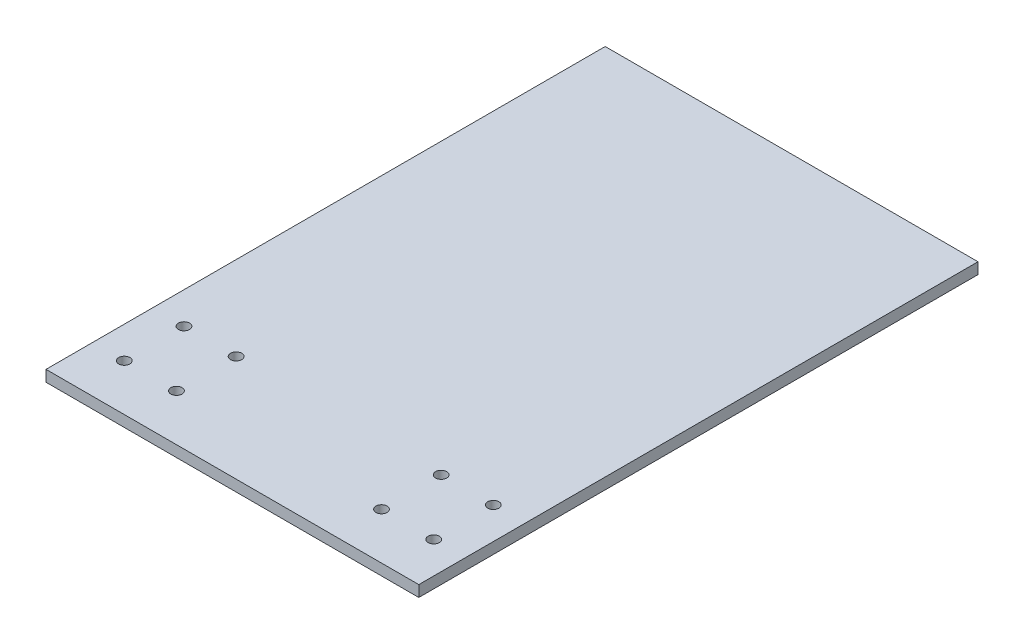
ISO-10303-21;
HEADER;
FILE_DESCRIPTION(('STEP AP214'),'2;1');
FILE_NAME('part.step','',(''),(''),'','','');
FILE_SCHEMA(('AUTOMOTIVE_DESIGN { 1 0 10303 214 1 1 1 1 }'));
ENDSEC;
DATA;
#1=APPLICATION_CONTEXT('core data for automotive mechanical design processes');
#2=APPLICATION_PROTOCOL_DEFINITION('international standard','automotive_design',2000,#1);
#3=PRODUCT_CONTEXT('',#1,'mechanical');
#4=PRODUCT('Part','Part','',(#3));
#5=PRODUCT_RELATED_PRODUCT_CATEGORY('part','',(#4));
#6=PRODUCT_DEFINITION_FORMATION('','',#4);
#7=PRODUCT_DEFINITION_CONTEXT('part definition',#1,'design');
#8=PRODUCT_DEFINITION('design','',#6,#7);
#9=PRODUCT_DEFINITION_SHAPE('','',#8);
#10=(LENGTH_UNIT() NAMED_UNIT(*) SI_UNIT(.MILLI.,.METRE.));
#11=(NAMED_UNIT(*) PLANE_ANGLE_UNIT() SI_UNIT($,.RADIAN.));
#12=(NAMED_UNIT(*) SI_UNIT($,.STERADIAN.) SOLID_ANGLE_UNIT());
#13=UNCERTAINTY_MEASURE_WITH_UNIT(LENGTH_MEASURE(1.E-05),#10,'distance_accuracy_value','');
#14=(GEOMETRIC_REPRESENTATION_CONTEXT(3) GLOBAL_UNCERTAINTY_ASSIGNED_CONTEXT((#13)) GLOBAL_UNIT_ASSIGNED_CONTEXT((#10,
#11,#12)) REPRESENTATION_CONTEXT('',''));
#15=CARTESIAN_POINT('',(0.,0.,0.));
#16=DIRECTION('',(0.,0.,1.));
#17=DIRECTION('',(1.,0.,0.));
#18=AXIS2_PLACEMENT_3D('',#15,#16,#17);
#19=CARTESIAN_POINT('',(0.,3.,0.));
#20=DIRECTION('',(0.,1.,0.));
#21=DIRECTION('',(0.,0.,1.));
#22=AXIS2_PLACEMENT_3D('',#19,#20,#21);
#23=PLANE('',#22);
#24=CARTESIAN_POINT('',(27.5,3.,46.4999999999999));
#25=DIRECTION('',(0.,1.,0.));
#26=DIRECTION('',(0.,0.,-1.));
#27=AXIS2_PLACEMENT_3D('',#24,#25,#26);
#28=CIRCLE('',#27,1.5);
#29=CARTESIAN_POINT('',(27.5,3.,44.9999999999999));
#30=VERTEX_POINT('',#29);
#31=EDGE_CURVE('E174',#30,#30,#28,.T.);
#32=ORIENTED_EDGE('',*,*,#31,.F.);
#33=EDGE_LOOP('',(#32));
#34=FACE_BOUND('',#33,.T.);
#35=CARTESIAN_POINT('',(41.5,3.,62.4999999999999));
#36=DIRECTION('',(0.,1.,0.));
#37=DIRECTION('',(0.,0.,-1.));
#38=AXIS2_PLACEMENT_3D('',#35,#36,#37);
#39=CIRCLE('',#38,1.5);
#40=CARTESIAN_POINT('',(41.5,3.,60.9999999999999));
#41=VERTEX_POINT('',#40);
#42=EDGE_CURVE('E158',#41,#41,#39,.T.);
#43=ORIENTED_EDGE('',*,*,#42,.F.);
#44=EDGE_LOOP('',(#43));
#45=FACE_BOUND('',#44,.T.);
#46=CARTESIAN_POINT('',(-27.5,3.,62.5));
#47=DIRECTION('',(0.,1.,0.));
#48=DIRECTION('',(0.,0.,-1.));
#49=AXIS2_PLACEMENT_3D('',#46,#47,#48);
#50=CIRCLE('',#49,1.5);
#51=CARTESIAN_POINT('',(-27.5,3.,61.));
#52=VERTEX_POINT('',#51);
#53=EDGE_CURVE('E142',#52,#52,#50,.T.);
#54=ORIENTED_EDGE('',*,*,#53,.F.);
#55=EDGE_LOOP('',(#54));
#56=FACE_BOUND('',#55,.T.);
#57=CARTESIAN_POINT('',(-41.5,3.,62.5));
#58=DIRECTION('',(0.,1.,0.));
#59=DIRECTION('',(0.,0.,1.));
#60=AXIS2_PLACEMENT_3D('',#57,#58,#59);
#61=CIRCLE('',#60,1.5);
#62=CARTESIAN_POINT('',(-41.5,3.,64.));
#63=VERTEX_POINT('',#62);
#64=EDGE_CURVE('E112',#63,#63,#61,.T.);
#65=ORIENTED_EDGE('',*,*,#64,.F.);
#66=EDGE_LOOP('',(#65));
#67=FACE_BOUND('',#66,.T.);
#68=DIRECTION('',(0.,0.,-1.));
#69=VECTOR('',#68,1.);
#70=CARTESIAN_POINT('',(50.,3.,-75.));
#71=LINE('',#70,#69);
#72=CARTESIAN_POINT('',(50.,3.,75.));
#73=VERTEX_POINT('',#72);
#74=CARTESIAN_POINT('',(50.,3.,-75.));
#75=VERTEX_POINT('',#74);
#76=EDGE_CURVE('E92',#73,#75,#71,.T.);
#77=ORIENTED_EDGE('',*,*,#76,.T.);
#78=DIRECTION('',(-1.,0.,0.));
#79=VECTOR('',#78,1.);
#80=CARTESIAN_POINT('',(-50.,3.,-75.));
#81=LINE('',#80,#79);
#82=CARTESIAN_POINT('',(-50.,3.,-75.));
#83=VERTEX_POINT('',#82);
#84=EDGE_CURVE('E87',#75,#83,#81,.T.);
#85=ORIENTED_EDGE('',*,*,#84,.T.);
#86=DIRECTION('',(0.,0.,1.));
#87=VECTOR('',#86,1.);
#88=CARTESIAN_POINT('',(-50.,3.,-75.));
#89=LINE('',#88,#87);
#90=CARTESIAN_POINT('',(-50.,3.,75.));
#91=VERTEX_POINT('',#90);
#92=EDGE_CURVE('E90',#83,#91,#89,.T.);
#93=ORIENTED_EDGE('',*,*,#92,.T.);
#94=DIRECTION('',(1.,0.,0.));
#95=VECTOR('',#94,1.);
#96=CARTESIAN_POINT('',(-50.,3.,75.));
#97=LINE('',#96,#95);
#98=EDGE_CURVE('E57',#91,#73,#97,.T.);
#99=ORIENTED_EDGE('',*,*,#98,.T.);
#100=EDGE_LOOP('',(#77,#85,#93,#99));
#101=FACE_BOUND('',#100,.T.);
#102=CARTESIAN_POINT('',(-41.5,3.,46.5));
#103=DIRECTION('',(0.,1.,0.));
#104=DIRECTION('',(0.,0.,-1.));
#105=AXIS2_PLACEMENT_3D('',#102,#103,#104);
#106=CIRCLE('',#105,1.5);
#107=CARTESIAN_POINT('',(-41.5,3.,45.));
#108=VERTEX_POINT('',#107);
#109=EDGE_CURVE('E134',#108,#108,#106,.T.);
#110=ORIENTED_EDGE('',*,*,#109,.F.);
#111=EDGE_LOOP('',(#110));
#112=FACE_BOUND('',#111,.T.);
#113=CARTESIAN_POINT('',(-27.5,3.,46.5));
#114=DIRECTION('',(0.,1.,0.));
#115=DIRECTION('',(0.,0.,1.));
#116=AXIS2_PLACEMENT_3D('',#113,#114,#115);
#117=CIRCLE('',#116,1.5);
#118=CARTESIAN_POINT('',(-27.5,3.,48.));
#119=VERTEX_POINT('',#118);
#120=EDGE_CURVE('E150',#119,#119,#117,.T.);
#121=ORIENTED_EDGE('',*,*,#120,.F.);
#122=EDGE_LOOP('',(#121));
#123=FACE_BOUND('',#122,.T.);
#124=CARTESIAN_POINT('',(27.5,3.,62.4999999999999));
#125=DIRECTION('',(0.,1.,0.));
#126=DIRECTION('',(0.,0.,1.));
#127=AXIS2_PLACEMENT_3D('',#124,#125,#126);
#128=CIRCLE('',#127,1.5);
#129=CARTESIAN_POINT('',(27.5,3.,63.9999999999999));
#130=VERTEX_POINT('',#129);
#131=EDGE_CURVE('E166',#130,#130,#128,.T.);
#132=ORIENTED_EDGE('',*,*,#131,.F.);
#133=EDGE_LOOP('',(#132));
#134=FACE_BOUND('',#133,.T.);
#135=CARTESIAN_POINT('',(41.5,3.,46.4999999999999));
#136=DIRECTION('',(0.,1.,0.));
#137=DIRECTION('',(0.,0.,1.));
#138=AXIS2_PLACEMENT_3D('',#135,#136,#137);
#139=CIRCLE('',#138,1.5);
#140=CARTESIAN_POINT('',(41.5,3.,47.9999999999999));
#141=VERTEX_POINT('',#140);
#142=EDGE_CURVE('E182',#141,#141,#139,.T.);
#143=ORIENTED_EDGE('',*,*,#142,.F.);
#144=EDGE_LOOP('',(#143));
#145=FACE_BOUND('',#144,.T.);
#146=ADVANCED_FACE('F39',(#34,#45,#56,#67,#101,#112,#123,#134,#145),#23,.T.);
#147=CARTESIAN_POINT('',(0.,0.,0.));
#148=DIRECTION('',(0.,1.,0.));
#149=DIRECTION('',(0.,0.,1.));
#150=AXIS2_PLACEMENT_3D('',#147,#148,#149);
#151=PLANE('',#150);
#152=DIRECTION('',(0.,0.,-1.));
#153=VECTOR('',#152,1.);
#154=CARTESIAN_POINT('',(50.,0.,-75.));
#155=LINE('',#154,#153);
#156=CARTESIAN_POINT('',(50.,0.,75.));
#157=VERTEX_POINT('',#156);
#158=CARTESIAN_POINT('',(50.,0.,-75.));
#159=VERTEX_POINT('',#158);
#160=EDGE_CURVE('E108',#157,#159,#155,.T.);
#161=ORIENTED_EDGE('',*,*,#160,.F.);
#162=DIRECTION('',(1.,0.,0.));
#163=VECTOR('',#162,1.);
#164=CARTESIAN_POINT('',(-50.,0.,75.));
#165=LINE('',#164,#163);
#166=CARTESIAN_POINT('',(-50.,0.,75.));
#167=VERTEX_POINT('',#166);
#168=EDGE_CURVE('E80',#167,#157,#165,.T.);
#169=ORIENTED_EDGE('',*,*,#168,.F.);
#170=DIRECTION('',(0.,0.,1.));
#171=VECTOR('',#170,1.);
#172=CARTESIAN_POINT('',(-50.,0.,-75.));
#173=LINE('',#172,#171);
#174=CARTESIAN_POINT('',(-50.,0.,-75.));
#175=VERTEX_POINT('',#174);
#176=EDGE_CURVE('E74',#175,#167,#173,.T.);
#177=ORIENTED_EDGE('',*,*,#176,.F.);
#178=DIRECTION('',(-1.,0.,0.));
#179=VECTOR('',#178,1.);
#180=CARTESIAN_POINT('',(-50.,0.,-75.));
#181=LINE('',#180,#179);
#182=EDGE_CURVE('E97',#159,#175,#181,.T.);
#183=ORIENTED_EDGE('',*,*,#182,.F.);
#184=EDGE_LOOP('',(#161,#169,#177,#183));
#185=FACE_BOUND('',#184,.T.);
#186=CARTESIAN_POINT('',(-41.5,0.,62.5));
#187=DIRECTION('',(0.,1.,0.));
#188=DIRECTION('',(0.,0.,1.));
#189=AXIS2_PLACEMENT_3D('',#186,#187,#188);
#190=CIRCLE('',#189,1.5);
#191=CARTESIAN_POINT('',(-41.5,0.,64.));
#192=VERTEX_POINT('',#191);
#193=EDGE_CURVE('E130',#192,#192,#190,.T.);
#194=ORIENTED_EDGE('',*,*,#193,.T.);
#195=EDGE_LOOP('',(#194));
#196=FACE_BOUND('',#195,.T.);
#197=CARTESIAN_POINT('',(-41.5,0.,46.5));
#198=DIRECTION('',(0.,1.,0.));
#199=DIRECTION('',(0.,0.,-1.));
#200=AXIS2_PLACEMENT_3D('',#197,#198,#199);
#201=CIRCLE('',#200,1.5);
#202=CARTESIAN_POINT('',(-41.5,0.,45.));
#203=VERTEX_POINT('',#202);
#204=EDGE_CURVE('E138',#203,#203,#201,.T.);
#205=ORIENTED_EDGE('',*,*,#204,.T.);
#206=EDGE_LOOP('',(#205));
#207=FACE_BOUND('',#206,.T.);
#208=CARTESIAN_POINT('',(-27.5,0.,62.5));
#209=DIRECTION('',(0.,1.,0.));
#210=DIRECTION('',(0.,0.,-1.));
#211=AXIS2_PLACEMENT_3D('',#208,#209,#210);
#212=CIRCLE('',#211,1.5);
#213=CARTESIAN_POINT('',(-27.5,0.,61.));
#214=VERTEX_POINT('',#213);
#215=EDGE_CURVE('E146',#214,#214,#212,.T.);
#216=ORIENTED_EDGE('',*,*,#215,.T.);
#217=EDGE_LOOP('',(#216));
#218=FACE_BOUND('',#217,.T.);
#219=CARTESIAN_POINT('',(-27.5,0.,46.5));
#220=DIRECTION('',(0.,1.,0.));
#221=DIRECTION('',(0.,0.,1.));
#222=AXIS2_PLACEMENT_3D('',#219,#220,#221);
#223=CIRCLE('',#222,1.5);
#224=CARTESIAN_POINT('',(-27.5,0.,48.));
#225=VERTEX_POINT('',#224);
#226=EDGE_CURVE('E154',#225,#225,#223,.T.);
#227=ORIENTED_EDGE('',*,*,#226,.T.);
#228=EDGE_LOOP('',(#227));
#229=FACE_BOUND('',#228,.T.);
#230=CARTESIAN_POINT('',(41.5,0.,62.4999999999999));
#231=DIRECTION('',(0.,1.,0.));
#232=DIRECTION('',(0.,0.,-1.));
#233=AXIS2_PLACEMENT_3D('',#230,#231,#232);
#234=CIRCLE('',#233,1.5);
#235=CARTESIAN_POINT('',(41.5,0.,60.9999999999999));
#236=VERTEX_POINT('',#235);
#237=EDGE_CURVE('E162',#236,#236,#234,.T.);
#238=ORIENTED_EDGE('',*,*,#237,.T.);
#239=EDGE_LOOP('',(#238));
#240=FACE_BOUND('',#239,.T.);
#241=CARTESIAN_POINT('',(27.5,0.,62.4999999999999));
#242=DIRECTION('',(0.,1.,0.));
#243=DIRECTION('',(0.,0.,1.));
#244=AXIS2_PLACEMENT_3D('',#241,#242,#243);
#245=CIRCLE('',#244,1.5);
#246=CARTESIAN_POINT('',(27.5,0.,63.9999999999999));
#247=VERTEX_POINT('',#246);
#248=EDGE_CURVE('E170',#247,#247,#245,.T.);
#249=ORIENTED_EDGE('',*,*,#248,.T.);
#250=EDGE_LOOP('',(#249));
#251=FACE_BOUND('',#250,.T.);
#252=CARTESIAN_POINT('',(27.5,0.,46.4999999999999));
#253=DIRECTION('',(0.,1.,0.));
#254=DIRECTION('',(0.,0.,-1.));
#255=AXIS2_PLACEMENT_3D('',#252,#253,#254);
#256=CIRCLE('',#255,1.5);
#257=CARTESIAN_POINT('',(27.5,0.,44.9999999999999));
#258=VERTEX_POINT('',#257);
#259=EDGE_CURVE('E178',#258,#258,#256,.T.);
#260=ORIENTED_EDGE('',*,*,#259,.T.);
#261=EDGE_LOOP('',(#260));
#262=FACE_BOUND('',#261,.T.);
#263=CARTESIAN_POINT('',(41.5,0.,46.4999999999999));
#264=DIRECTION('',(0.,1.,0.));
#265=DIRECTION('',(0.,0.,1.));
#266=AXIS2_PLACEMENT_3D('',#263,#264,#265);
#267=CIRCLE('',#266,1.5);
#268=CARTESIAN_POINT('',(41.5,0.,47.9999999999999));
#269=VERTEX_POINT('',#268);
#270=EDGE_CURVE('E186',#269,#269,#267,.T.);
#271=ORIENTED_EDGE('',*,*,#270,.T.);
#272=EDGE_LOOP('',(#271));
#273=FACE_BOUND('',#272,.T.);
#274=ADVANCED_FACE('F125',(#185,#196,#207,#218,#229,#240,#251,#262,#273),#151,.F.);
#275=CARTESIAN_POINT('',(50.,3.,-75.));
#276=DIRECTION('',(-1.,0.,0.));
#277=DIRECTION('',(0.,0.,1.));
#278=AXIS2_PLACEMENT_3D('',#275,#276,#277);
#279=PLANE('',#278);
#280=ORIENTED_EDGE('',*,*,#160,.T.);
#281=DIRECTION('',(0.,-1.,0.));
#282=VECTOR('',#281,1.);
#283=CARTESIAN_POINT('',(50.,3.,-75.));
#284=LINE('',#283,#282);
#285=EDGE_CURVE('E11',#75,#159,#284,.T.);
#286=ORIENTED_EDGE('',*,*,#285,.F.);
#287=ORIENTED_EDGE('',*,*,#76,.F.);
#288=DIRECTION('',(0.,-1.,0.));
#289=VECTOR('',#288,1.);
#290=CARTESIAN_POINT('',(50.,3.,75.));
#291=LINE('',#290,#289);
#292=EDGE_CURVE('E104',#73,#157,#291,.T.);
#293=ORIENTED_EDGE('',*,*,#292,.T.);
#294=EDGE_LOOP('',(#280,#286,#287,#293));
#295=FACE_BOUND('',#294,.T.);
#296=ADVANCED_FACE('F41',(#295),#279,.F.);
#297=CARTESIAN_POINT('',(-50.,3.,-75.));
#298=DIRECTION('',(0.,0.,1.));
#299=DIRECTION('',(1.,0.,0.));
#300=AXIS2_PLACEMENT_3D('',#297,#298,#299);
#301=PLANE('',#300);
#302=ORIENTED_EDGE('',*,*,#182,.T.);
#303=DIRECTION('',(0.,-1.,0.));
#304=VECTOR('',#303,1.);
#305=CARTESIAN_POINT('',(-50.,3.,-75.));
#306=LINE('',#305,#304);
#307=EDGE_CURVE('E49',#83,#175,#306,.T.);
#308=ORIENTED_EDGE('',*,*,#307,.F.);
#309=ORIENTED_EDGE('',*,*,#84,.F.);
#310=ORIENTED_EDGE('',*,*,#285,.T.);
#311=EDGE_LOOP('',(#302,#308,#309,#310));
#312=FACE_BOUND('',#311,.T.);
#313=ADVANCED_FACE('F96',(#312),#301,.F.);
#314=CARTESIAN_POINT('',(-50.,3.,-75.));
#315=DIRECTION('',(1.,0.,0.));
#316=DIRECTION('',(0.,0.,-1.));
#317=AXIS2_PLACEMENT_3D('',#314,#315,#316);
#318=PLANE('',#317);
#319=ORIENTED_EDGE('',*,*,#176,.T.);
#320=DIRECTION('',(0.,-1.,0.));
#321=VECTOR('',#320,1.);
#322=CARTESIAN_POINT('',(-50.,3.,75.));
#323=LINE('',#322,#321);
#324=EDGE_CURVE('E99',#91,#167,#323,.T.);
#325=ORIENTED_EDGE('',*,*,#324,.F.);
#326=ORIENTED_EDGE('',*,*,#92,.F.);
#327=ORIENTED_EDGE('',*,*,#307,.T.);
#328=EDGE_LOOP('',(#319,#325,#326,#327));
#329=FACE_BOUND('',#328,.T.);
#330=ADVANCED_FACE('F100',(#329),#318,.F.);
#331=CARTESIAN_POINT('',(-50.,3.,75.));
#332=DIRECTION('',(0.,0.,-1.));
#333=DIRECTION('',(-1.,0.,0.));
#334=AXIS2_PLACEMENT_3D('',#331,#332,#333);
#335=PLANE('',#334);
#336=ORIENTED_EDGE('',*,*,#168,.T.);
#337=ORIENTED_EDGE('',*,*,#292,.F.);
#338=ORIENTED_EDGE('',*,*,#98,.F.);
#339=ORIENTED_EDGE('',*,*,#324,.T.);
#340=EDGE_LOOP('',(#336,#337,#338,#339));
#341=FACE_BOUND('',#340,.T.);
#342=ADVANCED_FACE('F122',(#341),#335,.F.);
#343=CARTESIAN_POINT('',(-41.5,3.,62.5));
#344=DIRECTION('',(0.,-1.,0.));
#345=DIRECTION('',(0.,0.,-1.));
#346=AXIS2_PLACEMENT_3D('',#343,#344,#345);
#347=CYLINDRICAL_SURFACE('',#346,1.5);
#348=ORIENTED_EDGE('',*,*,#64,.T.);
#349=EDGE_LOOP('',(#348));
#350=FACE_BOUND('',#349,.T.);
#351=ORIENTED_EDGE('',*,*,#193,.F.);
#352=EDGE_LOOP('',(#351));
#353=FACE_BOUND('',#352,.T.);
#354=ADVANCED_FACE('F207',(#350,#353),#347,.F.);
#355=CARTESIAN_POINT('',(-41.5,3.,46.5));
#356=DIRECTION('',(0.,-1.,0.));
#357=DIRECTION('',(0.,0.,-1.));
#358=AXIS2_PLACEMENT_3D('',#355,#356,#357);
#359=CYLINDRICAL_SURFACE('',#358,1.5);
#360=ORIENTED_EDGE('',*,*,#109,.T.);
#361=EDGE_LOOP('',(#360));
#362=FACE_BOUND('',#361,.T.);
#363=ORIENTED_EDGE('',*,*,#204,.F.);
#364=EDGE_LOOP('',(#363));
#365=FACE_BOUND('',#364,.T.);
#366=ADVANCED_FACE('F253',(#362,#365),#359,.F.);
#367=CARTESIAN_POINT('',(-27.5,3.,62.5));
#368=DIRECTION('',(0.,-1.,0.));
#369=DIRECTION('',(0.,0.,-1.));
#370=AXIS2_PLACEMENT_3D('',#367,#368,#369);
#371=CYLINDRICAL_SURFACE('',#370,1.5);
#372=ORIENTED_EDGE('',*,*,#53,.T.);
#373=EDGE_LOOP('',(#372));
#374=FACE_BOUND('',#373,.T.);
#375=ORIENTED_EDGE('',*,*,#215,.F.);
#376=EDGE_LOOP('',(#375));
#377=FACE_BOUND('',#376,.T.);
#378=ADVANCED_FACE('F261',(#374,#377),#371,.F.);
#379=CARTESIAN_POINT('',(-27.5,3.,46.5));
#380=DIRECTION('',(0.,-1.,0.));
#381=DIRECTION('',(0.,0.,-1.));
#382=AXIS2_PLACEMENT_3D('',#379,#380,#381);
#383=CYLINDRICAL_SURFACE('',#382,1.5);
#384=ORIENTED_EDGE('',*,*,#120,.T.);
#385=EDGE_LOOP('',(#384));
#386=FACE_BOUND('',#385,.T.);
#387=ORIENTED_EDGE('',*,*,#226,.F.);
#388=EDGE_LOOP('',(#387));
#389=FACE_BOUND('',#388,.T.);
#390=ADVANCED_FACE('F269',(#386,#389),#383,.F.);
#391=CARTESIAN_POINT('',(41.5,3.,62.4999999999999));
#392=DIRECTION('',(0.,-1.,0.));
#393=DIRECTION('',(0.,0.,-1.));
#394=AXIS2_PLACEMENT_3D('',#391,#392,#393);
#395=CYLINDRICAL_SURFACE('',#394,1.5);
#396=ORIENTED_EDGE('',*,*,#42,.T.);
#397=EDGE_LOOP('',(#396));
#398=FACE_BOUND('',#397,.T.);
#399=ORIENTED_EDGE('',*,*,#237,.F.);
#400=EDGE_LOOP('',(#399));
#401=FACE_BOUND('',#400,.T.);
#402=ADVANCED_FACE('F278',(#398,#401),#395,.F.);
#403=CARTESIAN_POINT('',(27.5,3.,62.4999999999999));
#404=DIRECTION('',(0.,-1.,0.));
#405=DIRECTION('',(0.,0.,-1.));
#406=AXIS2_PLACEMENT_3D('',#403,#404,#405);
#407=CYLINDRICAL_SURFACE('',#406,1.5);
#408=ORIENTED_EDGE('',*,*,#131,.T.);
#409=EDGE_LOOP('',(#408));
#410=FACE_BOUND('',#409,.T.);
#411=ORIENTED_EDGE('',*,*,#248,.F.);
#412=EDGE_LOOP('',(#411));
#413=FACE_BOUND('',#412,.T.);
#414=ADVANCED_FACE('F287',(#410,#413),#407,.F.);
#415=CARTESIAN_POINT('',(27.5,3.,46.4999999999999));
#416=DIRECTION('',(0.,-1.,0.));
#417=DIRECTION('',(0.,0.,-1.));
#418=AXIS2_PLACEMENT_3D('',#415,#416,#417);
#419=CYLINDRICAL_SURFACE('',#418,1.5);
#420=ORIENTED_EDGE('',*,*,#31,.T.);
#421=EDGE_LOOP('',(#420));
#422=FACE_BOUND('',#421,.T.);
#423=ORIENTED_EDGE('',*,*,#259,.F.);
#424=EDGE_LOOP('',(#423));
#425=FACE_BOUND('',#424,.T.);
#426=ADVANCED_FACE('F296',(#422,#425),#419,.F.);
#427=CARTESIAN_POINT('',(41.5,3.,46.4999999999999));
#428=DIRECTION('',(0.,-1.,0.));
#429=DIRECTION('',(0.,0.,-1.));
#430=AXIS2_PLACEMENT_3D('',#427,#428,#429);
#431=CYLINDRICAL_SURFACE('',#430,1.5);
#432=ORIENTED_EDGE('',*,*,#142,.T.);
#433=EDGE_LOOP('',(#432));
#434=FACE_BOUND('',#433,.T.);
#435=ORIENTED_EDGE('',*,*,#270,.F.);
#436=EDGE_LOOP('',(#435));
#437=FACE_BOUND('',#436,.T.);
#438=ADVANCED_FACE('F194',(#434,#437),#431,.F.);
#439=CLOSED_SHELL('',(#146,#274,#296,#313,#330,#342,#354,#366,#378,#390,#402,#414,#426,#438));
#440=MANIFOLD_SOLID_BREP('B2',#439);
#441=ADVANCED_BREP_SHAPE_REPRESENTATION('',(#18,#440),#14);
#442=SHAPE_DEFINITION_REPRESENTATION(#9,#441);
ENDSEC;
END-ISO-10303-21;
